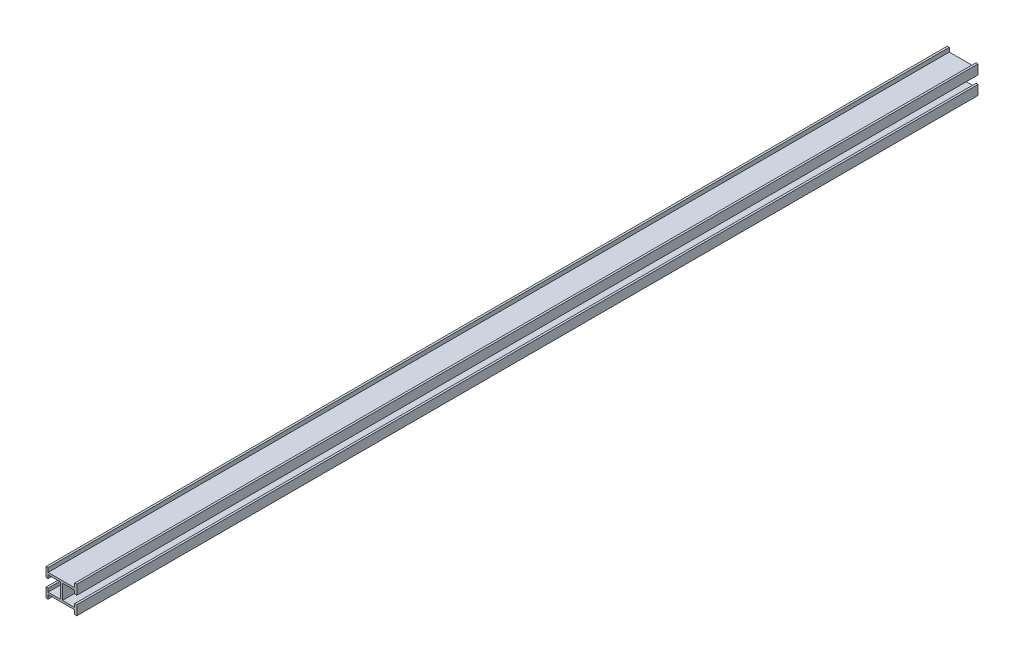
ISO-10303-21;
HEADER;
FILE_DESCRIPTION(('STEP AP214'),'2;1');
FILE_NAME('part.step','',(''),(''),'','','');
FILE_SCHEMA(('AUTOMOTIVE_DESIGN { 1 0 10303 214 1 1 1 1 }'));
ENDSEC;
DATA;
#1=APPLICATION_CONTEXT('core data for automotive mechanical design processes');
#2=APPLICATION_PROTOCOL_DEFINITION('international standard','automotive_design',2000,#1);
#3=PRODUCT_CONTEXT('',#1,'mechanical');
#4=PRODUCT('Part','Part','',(#3));
#5=PRODUCT_RELATED_PRODUCT_CATEGORY('part','',(#4));
#6=PRODUCT_DEFINITION_FORMATION('','',#4);
#7=PRODUCT_DEFINITION_CONTEXT('part definition',#1,'design');
#8=PRODUCT_DEFINITION('design','',#6,#7);
#9=PRODUCT_DEFINITION_SHAPE('','',#8);
#10=(LENGTH_UNIT() NAMED_UNIT(*) SI_UNIT(.MILLI.,.METRE.));
#11=(NAMED_UNIT(*) PLANE_ANGLE_UNIT() SI_UNIT($,.RADIAN.));
#12=(NAMED_UNIT(*) SI_UNIT($,.STERADIAN.) SOLID_ANGLE_UNIT());
#13=UNCERTAINTY_MEASURE_WITH_UNIT(LENGTH_MEASURE(1.E-05),#10,'distance_accuracy_value','');
#14=(GEOMETRIC_REPRESENTATION_CONTEXT(3) GLOBAL_UNCERTAINTY_ASSIGNED_CONTEXT((#13)) GLOBAL_UNIT_ASSIGNED_CONTEXT((#10,
#11,#12)) REPRESENTATION_CONTEXT('',''));
#15=CARTESIAN_POINT('',(0.,0.,0.));
#16=DIRECTION('',(0.,0.,1.));
#17=DIRECTION('',(1.,0.,0.));
#18=AXIS2_PLACEMENT_3D('',#15,#16,#17);
#19=CARTESIAN_POINT('',(-19.5,14.,659.));
#20=DIRECTION('',(-1.,0.,0.));
#21=DIRECTION('',(0.,0.,1.));
#22=AXIS2_PLACEMENT_3D('',#19,#20,#21);
#23=PLANE('',#22);
#24=DIRECTION('',(0.,1.,0.));
#25=VECTOR('',#24,1.);
#26=CARTESIAN_POINT('',(-19.5,14.,-659.));
#27=LINE('',#26,#25);
#28=CARTESIAN_POINT('',(-19.5,14.,-659.));
#29=VERTEX_POINT('',#28);
#30=CARTESIAN_POINT('',(-19.5,20.,-659.));
#31=VERTEX_POINT('',#30);
#32=EDGE_CURVE('E250',#29,#31,#27,.T.);
#33=ORIENTED_EDGE('',*,*,#32,.T.);
#34=DIRECTION('',(0.,0.,-1.));
#35=VECTOR('',#34,1.);
#36=CARTESIAN_POINT('',(-19.5,20.,659.));
#37=LINE('',#36,#35);
#38=CARTESIAN_POINT('',(-19.5,20.,659.));
#39=VERTEX_POINT('',#38);
#40=EDGE_CURVE('E11',#39,#31,#37,.T.);
#41=ORIENTED_EDGE('',*,*,#40,.F.);
#42=DIRECTION('',(0.,1.,0.));
#43=VECTOR('',#42,1.);
#44=CARTESIAN_POINT('',(-19.5,14.,659.));
#45=LINE('',#44,#43);
#46=CARTESIAN_POINT('',(-19.5,14.,659.));
#47=VERTEX_POINT('',#46);
#48=EDGE_CURVE('E319',#47,#39,#45,.T.);
#49=ORIENTED_EDGE('',*,*,#48,.F.);
#50=DIRECTION('',(0.,0.,-1.));
#51=VECTOR('',#50,1.);
#52=CARTESIAN_POINT('',(-19.5,14.,659.));
#53=LINE('',#52,#51);
#54=EDGE_CURVE('E49',#47,#29,#53,.T.);
#55=ORIENTED_EDGE('',*,*,#54,.T.);
#56=EDGE_LOOP('',(#33,#41,#49,#55));
#57=FACE_BOUND('',#56,.T.);
#58=ADVANCED_FACE('F33',(#57),#23,.F.);
#59=CARTESIAN_POINT('',(-19.5,20.,659.));
#60=DIRECTION('',(0.,-1.,0.));
#61=DIRECTION('',(0.,0.,-1.));
#62=AXIS2_PLACEMENT_3D('',#59,#60,#61);
#63=PLANE('',#62);
#64=DIRECTION('',(-1.,0.,0.));
#65=VECTOR('',#64,1.);
#66=CARTESIAN_POINT('',(-19.5,20.,-659.));
#67=LINE('',#66,#65);
#68=CARTESIAN_POINT('',(-22.5,20.,-659.));
#69=VERTEX_POINT('',#68);
#70=EDGE_CURVE('E252',#31,#69,#67,.T.);
#71=ORIENTED_EDGE('',*,*,#70,.T.);
#72=DIRECTION('',(0.,0.,-1.));
#73=VECTOR('',#72,1.);
#74=CARTESIAN_POINT('',(-22.5,20.,659.));
#75=LINE('',#74,#73);
#76=CARTESIAN_POINT('',(-22.5,20.,659.));
#77=VERTEX_POINT('',#76);
#78=EDGE_CURVE('E41',#77,#69,#75,.T.);
#79=ORIENTED_EDGE('',*,*,#78,.F.);
#80=DIRECTION('',(-1.,0.,0.));
#81=VECTOR('',#80,1.);
#82=CARTESIAN_POINT('',(-19.5,20.,659.));
#83=LINE('',#82,#81);
#84=EDGE_CURVE('E147',#39,#77,#83,.T.);
#85=ORIENTED_EDGE('',*,*,#84,.F.);
#86=ORIENTED_EDGE('',*,*,#40,.T.);
#87=EDGE_LOOP('',(#71,#79,#85,#86));
#88=FACE_BOUND('',#87,.T.);
#89=ADVANCED_FACE('F465',(#88),#63,.F.);
#90=CARTESIAN_POINT('',(-22.5,20.,659.));
#91=DIRECTION('',(1.,0.,0.));
#92=DIRECTION('',(0.,0.,-1.));
#93=AXIS2_PLACEMENT_3D('',#90,#91,#92);
#94=PLANE('',#93);
#95=DIRECTION('',(0.,-1.,0.));
#96=VECTOR('',#95,1.);
#97=CARTESIAN_POINT('',(-22.5,20.,-659.));
#98=LINE('',#97,#96);
#99=CARTESIAN_POINT('',(-22.5,6.,-659.));
#100=VERTEX_POINT('',#99);
#101=EDGE_CURVE('E254',#69,#100,#98,.T.);
#102=ORIENTED_EDGE('',*,*,#101,.T.);
#103=DIRECTION('',(0.,0.,-1.));
#104=VECTOR('',#103,1.);
#105=CARTESIAN_POINT('',(-22.5,6.,659.));
#106=LINE('',#105,#104);
#107=CARTESIAN_POINT('',(-22.5,6.,659.));
#108=VERTEX_POINT('',#107);
#109=EDGE_CURVE('E374',#108,#100,#106,.T.);
#110=ORIENTED_EDGE('',*,*,#109,.F.);
#111=DIRECTION('',(0.,-1.,0.));
#112=VECTOR('',#111,1.);
#113=CARTESIAN_POINT('',(-22.5,20.,659.));
#114=LINE('',#113,#112);
#115=EDGE_CURVE('E382',#77,#108,#114,.T.);
#116=ORIENTED_EDGE('',*,*,#115,.F.);
#117=ORIENTED_EDGE('',*,*,#78,.T.);
#118=EDGE_LOOP('',(#102,#110,#116,#117));
#119=FACE_BOUND('',#118,.T.);
#120=ADVANCED_FACE('F380',(#119),#94,.F.);
#121=CARTESIAN_POINT('',(-22.5,6.,659.));
#122=DIRECTION('',(0.,1.,0.));
#123=DIRECTION('',(0.,0.,1.));
#124=AXIS2_PLACEMENT_3D('',#121,#122,#123);
#125=PLANE('',#124);
#126=DIRECTION('',(1.,0.,0.));
#127=VECTOR('',#126,1.);
#128=CARTESIAN_POINT('',(-22.5,6.,-659.));
#129=LINE('',#128,#127);
#130=CARTESIAN_POINT('',(-19.5,6.,-659.));
#131=VERTEX_POINT('',#130);
#132=EDGE_CURVE('E256',#100,#131,#129,.T.);
#133=ORIENTED_EDGE('',*,*,#132,.T.);
#134=DIRECTION('',(0.,0.,-1.));
#135=VECTOR('',#134,1.);
#136=CARTESIAN_POINT('',(-19.5,6.,659.));
#137=LINE('',#136,#135);
#138=CARTESIAN_POINT('',(-19.5,6.,659.));
#139=VERTEX_POINT('',#138);
#140=EDGE_CURVE('E371',#139,#131,#137,.T.);
#141=ORIENTED_EDGE('',*,*,#140,.F.);
#142=DIRECTION('',(1.,0.,0.));
#143=VECTOR('',#142,1.);
#144=CARTESIAN_POINT('',(-22.5,6.,659.));
#145=LINE('',#144,#143);
#146=EDGE_CURVE('E399',#108,#139,#145,.T.);
#147=ORIENTED_EDGE('',*,*,#146,.F.);
#148=ORIENTED_EDGE('',*,*,#109,.T.);
#149=EDGE_LOOP('',(#133,#141,#147,#148));
#150=FACE_BOUND('',#149,.T.);
#151=ADVANCED_FACE('F390',(#150),#125,.F.);
#152=CARTESIAN_POINT('',(-19.5,6.,659.));
#153=DIRECTION('',(-1.,0.,0.));
#154=DIRECTION('',(0.,0.,1.));
#155=AXIS2_PLACEMENT_3D('',#152,#153,#154);
#156=PLANE('',#155);
#157=DIRECTION('',(0.,1.,0.));
#158=VECTOR('',#157,1.);
#159=CARTESIAN_POINT('',(-19.5,6.,-659.));
#160=LINE('',#159,#158);
#161=CARTESIAN_POINT('',(-19.5,11.,-659.));
#162=VERTEX_POINT('',#161);
#163=EDGE_CURVE('E258',#131,#162,#160,.T.);
#164=ORIENTED_EDGE('',*,*,#163,.T.);
#165=DIRECTION('',(0.,0.,-1.));
#166=VECTOR('',#165,1.);
#167=CARTESIAN_POINT('',(-19.5,11.,659.));
#168=LINE('',#167,#166);
#169=CARTESIAN_POINT('',(-19.5,11.,659.));
#170=VERTEX_POINT('',#169);
#171=EDGE_CURVE('E368',#170,#162,#168,.T.);
#172=ORIENTED_EDGE('',*,*,#171,.F.);
#173=DIRECTION('',(0.,1.,0.));
#174=VECTOR('',#173,1.);
#175=CARTESIAN_POINT('',(-19.5,6.,659.));
#176=LINE('',#175,#174);
#177=EDGE_CURVE('E396',#139,#170,#176,.T.);
#178=ORIENTED_EDGE('',*,*,#177,.F.);
#179=ORIENTED_EDGE('',*,*,#140,.T.);
#180=EDGE_LOOP('',(#164,#172,#178,#179));
#181=FACE_BOUND('',#180,.T.);
#182=ADVANCED_FACE('F394',(#181),#156,.F.);
#183=CARTESIAN_POINT('',(-19.5,11.,659.));
#184=DIRECTION('',(0.,1.,0.));
#185=DIRECTION('',(-1.,0.,0.));
#186=AXIS2_PLACEMENT_3D('',#183,#184,#185);
#187=PLANE('',#186);
#188=DIRECTION('',(1.,0.,0.));
#189=VECTOR('',#188,1.);
#190=CARTESIAN_POINT('',(-19.5,11.,-659.));
#191=LINE('',#190,#189);
#192=CARTESIAN_POINT('',(-1.5,11.,-659.));
#193=VERTEX_POINT('',#192);
#194=EDGE_CURVE('E260',#162,#193,#191,.T.);
#195=ORIENTED_EDGE('',*,*,#194,.T.);
#196=DIRECTION('',(0.,0.,-1.));
#197=VECTOR('',#196,1.);
#198=CARTESIAN_POINT('',(-1.5,11.,659.));
#199=LINE('',#198,#197);
#200=CARTESIAN_POINT('',(-1.5,11.,659.));
#201=VERTEX_POINT('',#200);
#202=EDGE_CURVE('E365',#201,#193,#199,.T.);
#203=ORIENTED_EDGE('',*,*,#202,.F.);
#204=DIRECTION('',(1.,0.,0.));
#205=VECTOR('',#204,1.);
#206=CARTESIAN_POINT('',(-19.5,11.,659.));
#207=LINE('',#206,#205);
#208=EDGE_CURVE('E398',#170,#201,#207,.T.);
#209=ORIENTED_EDGE('',*,*,#208,.F.);
#210=ORIENTED_EDGE('',*,*,#171,.T.);
#211=EDGE_LOOP('',(#195,#203,#209,#210));
#212=FACE_BOUND('',#211,.T.);
#213=ADVANCED_FACE('F481',(#212),#187,.F.);
#214=CARTESIAN_POINT('',(-1.5,11.,659.));
#215=DIRECTION('',(1.,0.,0.));
#216=DIRECTION('',(0.,0.,-1.));
#217=AXIS2_PLACEMENT_3D('',#214,#215,#216);
#218=PLANE('',#217);
#219=DIRECTION('',(0.,-1.,0.));
#220=VECTOR('',#219,1.);
#221=CARTESIAN_POINT('',(-1.5,11.,-659.));
#222=LINE('',#221,#220);
#223=CARTESIAN_POINT('',(-1.5,-11.,-659.));
#224=VERTEX_POINT('',#223);
#225=EDGE_CURVE('E262',#193,#224,#222,.T.);
#226=ORIENTED_EDGE('',*,*,#225,.T.);
#227=DIRECTION('',(0.,0.,-1.));
#228=VECTOR('',#227,1.);
#229=CARTESIAN_POINT('',(-1.5,-11.,659.));
#230=LINE('',#229,#228);
#231=CARTESIAN_POINT('',(-1.5,-11.,659.));
#232=VERTEX_POINT('',#231);
#233=EDGE_CURVE('E363',#232,#224,#230,.T.);
#234=ORIENTED_EDGE('',*,*,#233,.F.);
#235=DIRECTION('',(0.,-1.,0.));
#236=VECTOR('',#235,1.);
#237=CARTESIAN_POINT('',(-1.5,11.,659.));
#238=LINE('',#237,#236);
#239=EDGE_CURVE('E401',#201,#232,#238,.T.);
#240=ORIENTED_EDGE('',*,*,#239,.F.);
#241=ORIENTED_EDGE('',*,*,#202,.T.);
#242=EDGE_LOOP('',(#226,#234,#240,#241));
#243=FACE_BOUND('',#242,.T.);
#244=ADVANCED_FACE('F484',(#243),#218,.F.);
#245=CARTESIAN_POINT('',(-19.5,-11.,659.));
#246=DIRECTION('',(0.,1.,0.));
#247=DIRECTION('',(-1.,0.,0.));
#248=AXIS2_PLACEMENT_3D('',#245,#246,#247);
#249=PLANE('',#248);
#250=DIRECTION('',(1.,0.,0.));
#251=VECTOR('',#250,1.);
#252=CARTESIAN_POINT('',(-19.5,-11.,-659.));
#253=LINE('',#252,#251);
#254=CARTESIAN_POINT('',(-19.5,-11.,-659.));
#255=VERTEX_POINT('',#254);
#256=EDGE_CURVE('E265',#255,#224,#253,.T.);
#257=ORIENTED_EDGE('',*,*,#256,.F.);
#258=DIRECTION('',(0.,0.,-1.));
#259=VECTOR('',#258,1.);
#260=CARTESIAN_POINT('',(-19.5,-11.,659.));
#261=LINE('',#260,#259);
#262=CARTESIAN_POINT('',(-19.5,-11.,659.));
#263=VERTEX_POINT('',#262);
#264=EDGE_CURVE('E361',#263,#255,#261,.T.);
#265=ORIENTED_EDGE('',*,*,#264,.F.);
#266=DIRECTION('',(1.,0.,0.));
#267=VECTOR('',#266,1.);
#268=CARTESIAN_POINT('',(-19.5,-11.,659.));
#269=LINE('',#268,#267);
#270=EDGE_CURVE('E407',#263,#232,#269,.T.);
#271=ORIENTED_EDGE('',*,*,#270,.T.);
#272=ORIENTED_EDGE('',*,*,#233,.T.);
#273=EDGE_LOOP('',(#257,#265,#271,#272));
#274=FACE_BOUND('',#273,.T.);
#275=ADVANCED_FACE('F488',(#274),#249,.T.);
#276=CARTESIAN_POINT('',(-19.5,-6.,659.));
#277=DIRECTION('',(1.,0.,0.));
#278=DIRECTION('',(0.,0.,-1.));
#279=AXIS2_PLACEMENT_3D('',#276,#277,#278);
#280=PLANE('',#279);
#281=DIRECTION('',(0.,-1.,0.));
#282=VECTOR('',#281,1.);
#283=CARTESIAN_POINT('',(-19.5,-6.,-659.));
#284=LINE('',#283,#282);
#285=CARTESIAN_POINT('',(-19.5,-6.,-659.));
#286=VERTEX_POINT('',#285);
#287=EDGE_CURVE('E268',#286,#255,#284,.T.);
#288=ORIENTED_EDGE('',*,*,#287,.F.);
#289=DIRECTION('',(0.,0.,-1.));
#290=VECTOR('',#289,1.);
#291=CARTESIAN_POINT('',(-19.5,-6.,659.));
#292=LINE('',#291,#290);
#293=CARTESIAN_POINT('',(-19.5,-6.,659.));
#294=VERTEX_POINT('',#293);
#295=EDGE_CURVE('E359',#294,#286,#292,.T.);
#296=ORIENTED_EDGE('',*,*,#295,.F.);
#297=DIRECTION('',(0.,-1.,0.));
#298=VECTOR('',#297,1.);
#299=CARTESIAN_POINT('',(-19.5,-6.,659.));
#300=LINE('',#299,#298);
#301=EDGE_CURVE('E410',#294,#263,#300,.T.);
#302=ORIENTED_EDGE('',*,*,#301,.T.);
#303=ORIENTED_EDGE('',*,*,#264,.T.);
#304=EDGE_LOOP('',(#288,#296,#302,#303));
#305=FACE_BOUND('',#304,.T.);
#306=ADVANCED_FACE('F492',(#305),#280,.T.);
#307=CARTESIAN_POINT('',(-22.5,-6.,659.));
#308=DIRECTION('',(0.,1.,0.));
#309=DIRECTION('',(0.,0.,1.));
#310=AXIS2_PLACEMENT_3D('',#307,#308,#309);
#311=PLANE('',#310);
#312=DIRECTION('',(1.,0.,0.));
#313=VECTOR('',#312,1.);
#314=CARTESIAN_POINT('',(-22.5,-6.,-659.));
#315=LINE('',#314,#313);
#316=CARTESIAN_POINT('',(-22.5,-6.,-659.));
#317=VERTEX_POINT('',#316);
#318=EDGE_CURVE('E271',#317,#286,#315,.T.);
#319=ORIENTED_EDGE('',*,*,#318,.F.);
#320=DIRECTION('',(0.,0.,-1.));
#321=VECTOR('',#320,1.);
#322=CARTESIAN_POINT('',(-22.5,-6.,659.));
#323=LINE('',#322,#321);
#324=CARTESIAN_POINT('',(-22.5,-6.,659.));
#325=VERTEX_POINT('',#324);
#326=EDGE_CURVE('E357',#325,#317,#323,.T.);
#327=ORIENTED_EDGE('',*,*,#326,.F.);
#328=DIRECTION('',(1.,0.,0.));
#329=VECTOR('',#328,1.);
#330=CARTESIAN_POINT('',(-22.5,-6.,659.));
#331=LINE('',#330,#329);
#332=EDGE_CURVE('E413',#325,#294,#331,.T.);
#333=ORIENTED_EDGE('',*,*,#332,.T.);
#334=ORIENTED_EDGE('',*,*,#295,.T.);
#335=EDGE_LOOP('',(#319,#327,#333,#334));
#336=FACE_BOUND('',#335,.T.);
#337=ADVANCED_FACE('F496',(#336),#311,.T.);
#338=CARTESIAN_POINT('',(-22.5,-20.,659.));
#339=DIRECTION('',(-1.,0.,0.));
#340=DIRECTION('',(0.,0.,1.));
#341=AXIS2_PLACEMENT_3D('',#338,#339,#340);
#342=PLANE('',#341);
#343=DIRECTION('',(0.,1.,0.));
#344=VECTOR('',#343,1.);
#345=CARTESIAN_POINT('',(-22.5,-20.,-659.));
#346=LINE('',#345,#344);
#347=CARTESIAN_POINT('',(-22.5,-20.,-659.));
#348=VERTEX_POINT('',#347);
#349=EDGE_CURVE('E274',#348,#317,#346,.T.);
#350=ORIENTED_EDGE('',*,*,#349,.F.);
#351=DIRECTION('',(0.,0.,-1.));
#352=VECTOR('',#351,1.);
#353=CARTESIAN_POINT('',(-22.5,-20.,659.));
#354=LINE('',#353,#352);
#355=CARTESIAN_POINT('',(-22.5,-20.,659.));
#356=VERTEX_POINT('',#355);
#357=EDGE_CURVE('E355',#356,#348,#354,.T.);
#358=ORIENTED_EDGE('',*,*,#357,.F.);
#359=DIRECTION('',(0.,1.,0.));
#360=VECTOR('',#359,1.);
#361=CARTESIAN_POINT('',(-22.5,-20.,659.));
#362=LINE('',#361,#360);
#363=EDGE_CURVE('E416',#356,#325,#362,.T.);
#364=ORIENTED_EDGE('',*,*,#363,.T.);
#365=ORIENTED_EDGE('',*,*,#326,.T.);
#366=EDGE_LOOP('',(#350,#358,#364,#365));
#367=FACE_BOUND('',#366,.T.);
#368=ADVANCED_FACE('F500',(#367),#342,.T.);
#369=CARTESIAN_POINT('',(-19.5,-20.,659.));
#370=DIRECTION('',(0.,-1.,0.));
#371=DIRECTION('',(0.,0.,-1.));
#372=AXIS2_PLACEMENT_3D('',#369,#370,#371);
#373=PLANE('',#372);
#374=DIRECTION('',(-1.,0.,0.));
#375=VECTOR('',#374,1.);
#376=CARTESIAN_POINT('',(-19.5,-20.,-659.));
#377=LINE('',#376,#375);
#378=CARTESIAN_POINT('',(-19.5,-20.,-659.));
#379=VERTEX_POINT('',#378);
#380=EDGE_CURVE('E277',#379,#348,#377,.T.);
#381=ORIENTED_EDGE('',*,*,#380,.F.);
#382=DIRECTION('',(0.,0.,-1.));
#383=VECTOR('',#382,1.);
#384=CARTESIAN_POINT('',(-19.5,-20.,659.));
#385=LINE('',#384,#383);
#386=CARTESIAN_POINT('',(-19.5,-20.,659.));
#387=VERTEX_POINT('',#386);
#388=EDGE_CURVE('E353',#387,#379,#385,.T.);
#389=ORIENTED_EDGE('',*,*,#388,.F.);
#390=DIRECTION('',(-1.,0.,0.));
#391=VECTOR('',#390,1.);
#392=CARTESIAN_POINT('',(-19.5,-20.,659.));
#393=LINE('',#392,#391);
#394=EDGE_CURVE('E419',#387,#356,#393,.T.);
#395=ORIENTED_EDGE('',*,*,#394,.T.);
#396=ORIENTED_EDGE('',*,*,#357,.T.);
#397=EDGE_LOOP('',(#381,#389,#395,#396));
#398=FACE_BOUND('',#397,.T.);
#399=ADVANCED_FACE('F504',(#398),#373,.T.);
#400=CARTESIAN_POINT('',(-19.5,-14.,659.));
#401=DIRECTION('',(1.,0.,0.));
#402=DIRECTION('',(0.,0.,-1.));
#403=AXIS2_PLACEMENT_3D('',#400,#401,#402);
#404=PLANE('',#403);
#405=DIRECTION('',(0.,-1.,0.));
#406=VECTOR('',#405,1.);
#407=CARTESIAN_POINT('',(-19.5,-14.,-659.));
#408=LINE('',#407,#406);
#409=CARTESIAN_POINT('',(-19.5,-14.,-659.));
#410=VERTEX_POINT('',#409);
#411=EDGE_CURVE('E280',#410,#379,#408,.T.);
#412=ORIENTED_EDGE('',*,*,#411,.F.);
#413=DIRECTION('',(0.,0.,-1.));
#414=VECTOR('',#413,1.);
#415=CARTESIAN_POINT('',(-19.5,-14.,659.));
#416=LINE('',#415,#414);
#417=CARTESIAN_POINT('',(-19.5,-14.,659.));
#418=VERTEX_POINT('',#417);
#419=EDGE_CURVE('E351',#418,#410,#416,.T.);
#420=ORIENTED_EDGE('',*,*,#419,.F.);
#421=DIRECTION('',(0.,-1.,0.));
#422=VECTOR('',#421,1.);
#423=CARTESIAN_POINT('',(-19.5,-14.,659.));
#424=LINE('',#423,#422);
#425=EDGE_CURVE('E422',#418,#387,#424,.T.);
#426=ORIENTED_EDGE('',*,*,#425,.T.);
#427=ORIENTED_EDGE('',*,*,#388,.T.);
#428=EDGE_LOOP('',(#412,#420,#426,#427));
#429=FACE_BOUND('',#428,.T.);
#430=ADVANCED_FACE('F508',(#429),#404,.T.);
#431=CARTESIAN_POINT('',(-19.5,-14.,659.));
#432=DIRECTION('',(0.,1.,0.));
#433=DIRECTION('',(-1.,0.,0.));
#434=AXIS2_PLACEMENT_3D('',#431,#432,#433);
#435=PLANE('',#434);
#436=DIRECTION('',(1.,0.,0.));
#437=VECTOR('',#436,1.);
#438=CARTESIAN_POINT('',(-19.5,-14.,-659.));
#439=LINE('',#438,#437);
#440=CARTESIAN_POINT('',(19.5,-14.,-659.));
#441=VERTEX_POINT('',#440);
#442=EDGE_CURVE('E283',#410,#441,#439,.T.);
#443=ORIENTED_EDGE('',*,*,#442,.T.);
#444=DIRECTION('',(0.,0.,-1.));
#445=VECTOR('',#444,1.);
#446=CARTESIAN_POINT('',(19.5,-14.,659.));
#447=LINE('',#446,#445);
#448=CARTESIAN_POINT('',(19.5,-14.,659.));
#449=VERTEX_POINT('',#448);
#450=EDGE_CURVE('E348',#449,#441,#447,.T.);
#451=ORIENTED_EDGE('',*,*,#450,.F.);
#452=DIRECTION('',(1.,0.,0.));
#453=VECTOR('',#452,1.);
#454=CARTESIAN_POINT('',(-19.5,-14.,659.));
#455=LINE('',#454,#453);
#456=EDGE_CURVE('E425',#418,#449,#455,.T.);
#457=ORIENTED_EDGE('',*,*,#456,.F.);
#458=ORIENTED_EDGE('',*,*,#419,.T.);
#459=EDGE_LOOP('',(#443,#451,#457,#458));
#460=FACE_BOUND('',#459,.T.);
#461=ADVANCED_FACE('F512',(#460),#435,.F.);
#462=CARTESIAN_POINT('',(19.5,-14.,659.));
#463=DIRECTION('',(1.,0.,0.));
#464=DIRECTION('',(0.,0.,-1.));
#465=AXIS2_PLACEMENT_3D('',#462,#463,#464);
#466=PLANE('',#465);
#467=DIRECTION('',(0.,-1.,0.));
#468=VECTOR('',#467,1.);
#469=CARTESIAN_POINT('',(19.5,-14.,-659.));
#470=LINE('',#469,#468);
#471=CARTESIAN_POINT('',(19.5,-20.,-659.));
#472=VERTEX_POINT('',#471);
#473=EDGE_CURVE('E285',#441,#472,#470,.T.);
#474=ORIENTED_EDGE('',*,*,#473,.T.);
#475=DIRECTION('',(0.,0.,-1.));
#476=VECTOR('',#475,1.);
#477=CARTESIAN_POINT('',(19.5,-20.,659.));
#478=LINE('',#477,#476);
#479=CARTESIAN_POINT('',(19.5,-20.,659.));
#480=VERTEX_POINT('',#479);
#481=EDGE_CURVE('E345',#480,#472,#478,.T.);
#482=ORIENTED_EDGE('',*,*,#481,.F.);
#483=DIRECTION('',(0.,-1.,0.));
#484=VECTOR('',#483,1.);
#485=CARTESIAN_POINT('',(19.5,-14.,659.));
#486=LINE('',#485,#484);
#487=EDGE_CURVE('E427',#449,#480,#486,.T.);
#488=ORIENTED_EDGE('',*,*,#487,.F.);
#489=ORIENTED_EDGE('',*,*,#450,.T.);
#490=EDGE_LOOP('',(#474,#482,#488,#489));
#491=FACE_BOUND('',#490,.T.);
#492=ADVANCED_FACE('F516',(#491),#466,.F.);
#493=CARTESIAN_POINT('',(19.5,-20.,659.));
#494=DIRECTION('',(0.,1.,0.));
#495=DIRECTION('',(0.,0.,1.));
#496=AXIS2_PLACEMENT_3D('',#493,#494,#495);
#497=PLANE('',#496);
#498=DIRECTION('',(1.,0.,0.));
#499=VECTOR('',#498,1.);
#500=CARTESIAN_POINT('',(19.5,-20.,-659.));
#501=LINE('',#500,#499);
#502=CARTESIAN_POINT('',(22.5,-20.,-659.));
#503=VERTEX_POINT('',#502);
#504=EDGE_CURVE('E287',#472,#503,#501,.T.);
#505=ORIENTED_EDGE('',*,*,#504,.T.);
#506=DIRECTION('',(0.,0.,-1.));
#507=VECTOR('',#506,1.);
#508=CARTESIAN_POINT('',(22.5,-20.,659.));
#509=LINE('',#508,#507);
#510=CARTESIAN_POINT('',(22.5,-20.,659.));
#511=VERTEX_POINT('',#510);
#512=EDGE_CURVE('E342',#511,#503,#509,.T.);
#513=ORIENTED_EDGE('',*,*,#512,.F.);
#514=DIRECTION('',(1.,0.,0.));
#515=VECTOR('',#514,1.);
#516=CARTESIAN_POINT('',(19.5,-20.,659.));
#517=LINE('',#516,#515);
#518=EDGE_CURVE('E429',#480,#511,#517,.T.);
#519=ORIENTED_EDGE('',*,*,#518,.F.);
#520=ORIENTED_EDGE('',*,*,#481,.T.);
#521=EDGE_LOOP('',(#505,#513,#519,#520));
#522=FACE_BOUND('',#521,.T.);
#523=ADVANCED_FACE('F520',(#522),#497,.F.);
#524=CARTESIAN_POINT('',(22.5,-20.,659.));
#525=DIRECTION('',(-1.,0.,0.));
#526=DIRECTION('',(0.,0.,1.));
#527=AXIS2_PLACEMENT_3D('',#524,#525,#526);
#528=PLANE('',#527);
#529=DIRECTION('',(0.,1.,0.));
#530=VECTOR('',#529,1.);
#531=CARTESIAN_POINT('',(22.5,-20.,-659.));
#532=LINE('',#531,#530);
#533=CARTESIAN_POINT('',(22.5,-6.,-659.));
#534=VERTEX_POINT('',#533);
#535=EDGE_CURVE('E289',#503,#534,#532,.T.);
#536=ORIENTED_EDGE('',*,*,#535,.T.);
#537=DIRECTION('',(0.,0.,-1.));
#538=VECTOR('',#537,1.);
#539=CARTESIAN_POINT('',(22.5,-6.,659.));
#540=LINE('',#539,#538);
#541=CARTESIAN_POINT('',(22.5,-6.,659.));
#542=VERTEX_POINT('',#541);
#543=EDGE_CURVE('E339',#542,#534,#540,.T.);
#544=ORIENTED_EDGE('',*,*,#543,.F.);
#545=DIRECTION('',(0.,1.,0.));
#546=VECTOR('',#545,1.);
#547=CARTESIAN_POINT('',(22.5,-20.,659.));
#548=LINE('',#547,#546);
#549=EDGE_CURVE('E431',#511,#542,#548,.T.);
#550=ORIENTED_EDGE('',*,*,#549,.F.);
#551=ORIENTED_EDGE('',*,*,#512,.T.);
#552=EDGE_LOOP('',(#536,#544,#550,#551));
#553=FACE_BOUND('',#552,.T.);
#554=ADVANCED_FACE('F524',(#553),#528,.F.);
#555=CARTESIAN_POINT('',(22.5,-6.,659.));
#556=DIRECTION('',(0.,-1.,0.));
#557=DIRECTION('',(0.,0.,-1.));
#558=AXIS2_PLACEMENT_3D('',#555,#556,#557);
#559=PLANE('',#558);
#560=DIRECTION('',(-1.,0.,0.));
#561=VECTOR('',#560,1.);
#562=CARTESIAN_POINT('',(22.5,-6.,-659.));
#563=LINE('',#562,#561);
#564=CARTESIAN_POINT('',(19.5,-6.,-659.));
#565=VERTEX_POINT('',#564);
#566=EDGE_CURVE('E291',#534,#565,#563,.T.);
#567=ORIENTED_EDGE('',*,*,#566,.T.);
#568=DIRECTION('',(0.,0.,-1.));
#569=VECTOR('',#568,1.);
#570=CARTESIAN_POINT('',(19.5,-6.,659.));
#571=LINE('',#570,#569);
#572=CARTESIAN_POINT('',(19.5,-6.,659.));
#573=VERTEX_POINT('',#572);
#574=EDGE_CURVE('E336',#573,#565,#571,.T.);
#575=ORIENTED_EDGE('',*,*,#574,.F.);
#576=DIRECTION('',(-1.,0.,0.));
#577=VECTOR('',#576,1.);
#578=CARTESIAN_POINT('',(22.5,-6.,659.));
#579=LINE('',#578,#577);
#580=EDGE_CURVE('E433',#542,#573,#579,.T.);
#581=ORIENTED_EDGE('',*,*,#580,.F.);
#582=ORIENTED_EDGE('',*,*,#543,.T.);
#583=EDGE_LOOP('',(#567,#575,#581,#582));
#584=FACE_BOUND('',#583,.T.);
#585=ADVANCED_FACE('F528',(#584),#559,.F.);
#586=CARTESIAN_POINT('',(19.5,-6.,659.));
#587=DIRECTION('',(1.,0.,0.));
#588=DIRECTION('',(0.,0.,-1.));
#589=AXIS2_PLACEMENT_3D('',#586,#587,#588);
#590=PLANE('',#589);
#591=DIRECTION('',(0.,-1.,0.));
#592=VECTOR('',#591,1.);
#593=CARTESIAN_POINT('',(19.5,-6.,-659.));
#594=LINE('',#593,#592);
#595=CARTESIAN_POINT('',(19.5,-11.,-659.));
#596=VERTEX_POINT('',#595);
#597=EDGE_CURVE('E293',#565,#596,#594,.T.);
#598=ORIENTED_EDGE('',*,*,#597,.T.);
#599=DIRECTION('',(0.,0.,-1.));
#600=VECTOR('',#599,1.);
#601=CARTESIAN_POINT('',(19.5,-11.,659.));
#602=LINE('',#601,#600);
#603=CARTESIAN_POINT('',(19.5,-11.,659.));
#604=VERTEX_POINT('',#603);
#605=EDGE_CURVE('E333',#604,#596,#602,.T.);
#606=ORIENTED_EDGE('',*,*,#605,.F.);
#607=DIRECTION('',(0.,-1.,0.));
#608=VECTOR('',#607,1.);
#609=CARTESIAN_POINT('',(19.5,-6.,659.));
#610=LINE('',#609,#608);
#611=EDGE_CURVE('E435',#573,#604,#610,.T.);
#612=ORIENTED_EDGE('',*,*,#611,.F.);
#613=ORIENTED_EDGE('',*,*,#574,.T.);
#614=EDGE_LOOP('',(#598,#606,#612,#613));
#615=FACE_BOUND('',#614,.T.);
#616=ADVANCED_FACE('F532',(#615),#590,.F.);
#617=CARTESIAN_POINT('',(19.5,-11.,659.));
#618=DIRECTION('',(0.,-1.,0.));
#619=DIRECTION('',(1.,0.,0.));
#620=AXIS2_PLACEMENT_3D('',#617,#618,#619);
#621=PLANE('',#620);
#622=DIRECTION('',(-1.,0.,0.));
#623=VECTOR('',#622,1.);
#624=CARTESIAN_POINT('',(19.5,-11.,-659.));
#625=LINE('',#624,#623);
#626=CARTESIAN_POINT('',(1.5,-11.,-659.));
#627=VERTEX_POINT('',#626);
#628=EDGE_CURVE('E295',#596,#627,#625,.T.);
#629=ORIENTED_EDGE('',*,*,#628,.T.);
#630=DIRECTION('',(0.,0.,-1.));
#631=VECTOR('',#630,1.);
#632=CARTESIAN_POINT('',(1.5,-11.,659.));
#633=LINE('',#632,#631);
#634=CARTESIAN_POINT('',(1.5,-11.,659.));
#635=VERTEX_POINT('',#634);
#636=EDGE_CURVE('E331',#635,#627,#633,.T.);
#637=ORIENTED_EDGE('',*,*,#636,.F.);
#638=DIRECTION('',(-1.,0.,0.));
#639=VECTOR('',#638,1.);
#640=CARTESIAN_POINT('',(19.5,-11.,659.));
#641=LINE('',#640,#639);
#642=EDGE_CURVE('E437',#604,#635,#641,.T.);
#643=ORIENTED_EDGE('',*,*,#642,.F.);
#644=ORIENTED_EDGE('',*,*,#605,.T.);
#645=EDGE_LOOP('',(#629,#637,#643,#644));
#646=FACE_BOUND('',#645,.T.);
#647=ADVANCED_FACE('F536',(#646),#621,.F.);
#648=CARTESIAN_POINT('',(1.5,11.,659.));
#649=DIRECTION('',(1.,0.,0.));
#650=DIRECTION('',(0.,0.,-1.));
#651=AXIS2_PLACEMENT_3D('',#648,#649,#650);
#652=PLANE('',#651);
#653=DIRECTION('',(0.,-1.,0.));
#654=VECTOR('',#653,1.);
#655=CARTESIAN_POINT('',(1.5,11.,-659.));
#656=LINE('',#655,#654);
#657=CARTESIAN_POINT('',(1.5,11.,-659.));
#658=VERTEX_POINT('',#657);
#659=EDGE_CURVE('E298',#658,#627,#656,.T.);
#660=ORIENTED_EDGE('',*,*,#659,.F.);
#661=DIRECTION('',(0.,0.,-1.));
#662=VECTOR('',#661,1.);
#663=CARTESIAN_POINT('',(1.5,11.,659.));
#664=LINE('',#663,#662);
#665=CARTESIAN_POINT('',(1.5,11.,659.));
#666=VERTEX_POINT('',#665);
#667=EDGE_CURVE('E329',#666,#658,#664,.T.);
#668=ORIENTED_EDGE('',*,*,#667,.F.);
#669=DIRECTION('',(0.,-1.,0.));
#670=VECTOR('',#669,1.);
#671=CARTESIAN_POINT('',(1.5,11.,659.));
#672=LINE('',#671,#670);
#673=EDGE_CURVE('E439',#666,#635,#672,.T.);
#674=ORIENTED_EDGE('',*,*,#673,.T.);
#675=ORIENTED_EDGE('',*,*,#636,.T.);
#676=EDGE_LOOP('',(#660,#668,#674,#675));
#677=FACE_BOUND('',#676,.T.);
#678=ADVANCED_FACE('F540',(#677),#652,.T.);
#679=CARTESIAN_POINT('',(19.5,11.,659.));
#680=DIRECTION('',(0.,-1.,0.));
#681=DIRECTION('',(1.,0.,0.));
#682=AXIS2_PLACEMENT_3D('',#679,#680,#681);
#683=PLANE('',#682);
#684=DIRECTION('',(-1.,0.,0.));
#685=VECTOR('',#684,1.);
#686=CARTESIAN_POINT('',(19.5,11.,-659.));
#687=LINE('',#686,#685);
#688=CARTESIAN_POINT('',(19.5,11.,-659.));
#689=VERTEX_POINT('',#688);
#690=EDGE_CURVE('E301',#689,#658,#687,.T.);
#691=ORIENTED_EDGE('',*,*,#690,.F.);
#692=DIRECTION('',(0.,0.,-1.));
#693=VECTOR('',#692,1.);
#694=CARTESIAN_POINT('',(19.5,11.,659.));
#695=LINE('',#694,#693);
#696=CARTESIAN_POINT('',(19.5,11.,659.));
#697=VERTEX_POINT('',#696);
#698=EDGE_CURVE('E327',#697,#689,#695,.T.);
#699=ORIENTED_EDGE('',*,*,#698,.F.);
#700=DIRECTION('',(-1.,0.,0.));
#701=VECTOR('',#700,1.);
#702=CARTESIAN_POINT('',(19.5,11.,659.));
#703=LINE('',#702,#701);
#704=EDGE_CURVE('E442',#697,#666,#703,.T.);
#705=ORIENTED_EDGE('',*,*,#704,.T.);
#706=ORIENTED_EDGE('',*,*,#667,.T.);
#707=EDGE_LOOP('',(#691,#699,#705,#706));
#708=FACE_BOUND('',#707,.T.);
#709=ADVANCED_FACE('F544',(#708),#683,.T.);
#710=CARTESIAN_POINT('',(19.5,6.,659.));
#711=DIRECTION('',(-1.,0.,0.));
#712=DIRECTION('',(0.,0.,1.));
#713=AXIS2_PLACEMENT_3D('',#710,#711,#712);
#714=PLANE('',#713);
#715=DIRECTION('',(0.,1.,0.));
#716=VECTOR('',#715,1.);
#717=CARTESIAN_POINT('',(19.5,6.,-659.));
#718=LINE('',#717,#716);
#719=CARTESIAN_POINT('',(19.5,6.,-659.));
#720=VERTEX_POINT('',#719);
#721=EDGE_CURVE('E304',#720,#689,#718,.T.);
#722=ORIENTED_EDGE('',*,*,#721,.F.);
#723=DIRECTION('',(0.,0.,-1.));
#724=VECTOR('',#723,1.);
#725=CARTESIAN_POINT('',(19.5,6.,659.));
#726=LINE('',#725,#724);
#727=CARTESIAN_POINT('',(19.5,6.,659.));
#728=VERTEX_POINT('',#727);
#729=EDGE_CURVE('E325',#728,#720,#726,.T.);
#730=ORIENTED_EDGE('',*,*,#729,.F.);
#731=DIRECTION('',(0.,1.,0.));
#732=VECTOR('',#731,1.);
#733=CARTESIAN_POINT('',(19.5,6.,659.));
#734=LINE('',#733,#732);
#735=EDGE_CURVE('E445',#728,#697,#734,.T.);
#736=ORIENTED_EDGE('',*,*,#735,.T.);
#737=ORIENTED_EDGE('',*,*,#698,.T.);
#738=EDGE_LOOP('',(#722,#730,#736,#737));
#739=FACE_BOUND('',#738,.T.);
#740=ADVANCED_FACE('F548',(#739),#714,.T.);
#741=CARTESIAN_POINT('',(22.5,6.,659.));
#742=DIRECTION('',(0.,-1.,0.));
#743=DIRECTION('',(0.,0.,-1.));
#744=AXIS2_PLACEMENT_3D('',#741,#742,#743);
#745=PLANE('',#744);
#746=DIRECTION('',(-1.,0.,0.));
#747=VECTOR('',#746,1.);
#748=CARTESIAN_POINT('',(22.5,6.,-659.));
#749=LINE('',#748,#747);
#750=CARTESIAN_POINT('',(22.5,6.,-659.));
#751=VERTEX_POINT('',#750);
#752=EDGE_CURVE('E307',#751,#720,#749,.T.);
#753=ORIENTED_EDGE('',*,*,#752,.F.);
#754=DIRECTION('',(0.,0.,-1.));
#755=VECTOR('',#754,1.);
#756=CARTESIAN_POINT('',(22.5,6.,659.));
#757=LINE('',#756,#755);
#758=CARTESIAN_POINT('',(22.5,6.,659.));
#759=VERTEX_POINT('',#758);
#760=EDGE_CURVE('E323',#759,#751,#757,.T.);
#761=ORIENTED_EDGE('',*,*,#760,.F.);
#762=DIRECTION('',(-1.,0.,0.));
#763=VECTOR('',#762,1.);
#764=CARTESIAN_POINT('',(22.5,6.,659.));
#765=LINE('',#764,#763);
#766=EDGE_CURVE('E448',#759,#728,#765,.T.);
#767=ORIENTED_EDGE('',*,*,#766,.T.);
#768=ORIENTED_EDGE('',*,*,#729,.T.);
#769=EDGE_LOOP('',(#753,#761,#767,#768));
#770=FACE_BOUND('',#769,.T.);
#771=ADVANCED_FACE('F552',(#770),#745,.T.);
#772=CARTESIAN_POINT('',(22.5,20.,659.));
#773=DIRECTION('',(1.,0.,0.));
#774=DIRECTION('',(0.,0.,-1.));
#775=AXIS2_PLACEMENT_3D('',#772,#773,#774);
#776=PLANE('',#775);
#777=DIRECTION('',(0.,-1.,0.));
#778=VECTOR('',#777,1.);
#779=CARTESIAN_POINT('',(22.5,20.,-659.));
#780=LINE('',#779,#778);
#781=CARTESIAN_POINT('',(22.5,20.,-659.));
#782=VERTEX_POINT('',#781);
#783=EDGE_CURVE('E310',#782,#751,#780,.T.);
#784=ORIENTED_EDGE('',*,*,#783,.F.);
#785=DIRECTION('',(0.,0.,-1.));
#786=VECTOR('',#785,1.);
#787=CARTESIAN_POINT('',(22.5,20.,659.));
#788=LINE('',#787,#786);
#789=CARTESIAN_POINT('',(22.5,20.,659.));
#790=VERTEX_POINT('',#789);
#791=EDGE_CURVE('E232',#790,#782,#788,.T.);
#792=ORIENTED_EDGE('',*,*,#791,.F.);
#793=DIRECTION('',(0.,-1.,0.));
#794=VECTOR('',#793,1.);
#795=CARTESIAN_POINT('',(22.5,20.,659.));
#796=LINE('',#795,#794);
#797=EDGE_CURVE('E242',#790,#759,#796,.T.);
#798=ORIENTED_EDGE('',*,*,#797,.T.);
#799=ORIENTED_EDGE('',*,*,#760,.T.);
#800=EDGE_LOOP('',(#784,#792,#798,#799));
#801=FACE_BOUND('',#800,.T.);
#802=ADVANCED_FACE('F452',(#801),#776,.T.);
#803=CARTESIAN_POINT('',(19.5,20.,659.));
#804=DIRECTION('',(0.,1.,0.));
#805=DIRECTION('',(0.,0.,1.));
#806=AXIS2_PLACEMENT_3D('',#803,#804,#805);
#807=PLANE('',#806);
#808=DIRECTION('',(1.,0.,0.));
#809=VECTOR('',#808,1.);
#810=CARTESIAN_POINT('',(19.5,20.,-659.));
#811=LINE('',#810,#809);
#812=CARTESIAN_POINT('',(19.5,20.,-659.));
#813=VERTEX_POINT('',#812);
#814=EDGE_CURVE('E228',#813,#782,#811,.T.);
#815=ORIENTED_EDGE('',*,*,#814,.F.);
#816=DIRECTION('',(0.,0.,-1.));
#817=VECTOR('',#816,1.);
#818=CARTESIAN_POINT('',(19.5,20.,659.));
#819=LINE('',#818,#817);
#820=CARTESIAN_POINT('',(19.5,20.,659.));
#821=VERTEX_POINT('',#820);
#822=EDGE_CURVE('E223',#821,#813,#819,.T.);
#823=ORIENTED_EDGE('',*,*,#822,.F.);
#824=DIRECTION('',(1.,0.,0.));
#825=VECTOR('',#824,1.);
#826=CARTESIAN_POINT('',(19.5,20.,659.));
#827=LINE('',#826,#825);
#828=EDGE_CURVE('E226',#821,#790,#827,.T.);
#829=ORIENTED_EDGE('',*,*,#828,.T.);
#830=ORIENTED_EDGE('',*,*,#791,.T.);
#831=EDGE_LOOP('',(#815,#823,#829,#830));
#832=FACE_BOUND('',#831,.T.);
#833=ADVANCED_FACE('F225',(#832),#807,.T.);
#834=CARTESIAN_POINT('',(19.5,14.,659.));
#835=DIRECTION('',(-1.,0.,0.));
#836=DIRECTION('',(0.,0.,1.));
#837=AXIS2_PLACEMENT_3D('',#834,#835,#836);
#838=PLANE('',#837);
#839=DIRECTION('',(0.,1.,0.));
#840=VECTOR('',#839,1.);
#841=CARTESIAN_POINT('',(19.5,14.,-659.));
#842=LINE('',#841,#840);
#843=CARTESIAN_POINT('',(19.5,14.,-659.));
#844=VERTEX_POINT('',#843);
#845=EDGE_CURVE('E314',#844,#813,#842,.T.);
#846=ORIENTED_EDGE('',*,*,#845,.F.);
#847=DIRECTION('',(0.,0.,-1.));
#848=VECTOR('',#847,1.);
#849=CARTESIAN_POINT('',(19.5,14.,659.));
#850=LINE('',#849,#848);
#851=CARTESIAN_POINT('',(19.5,14.,659.));
#852=VERTEX_POINT('',#851);
#853=EDGE_CURVE('E135',#852,#844,#850,.T.);
#854=ORIENTED_EDGE('',*,*,#853,.F.);
#855=DIRECTION('',(0.,1.,0.));
#856=VECTOR('',#855,1.);
#857=CARTESIAN_POINT('',(19.5,14.,659.));
#858=LINE('',#857,#856);
#859=EDGE_CURVE('E239',#852,#821,#858,.T.);
#860=ORIENTED_EDGE('',*,*,#859,.T.);
#861=ORIENTED_EDGE('',*,*,#822,.T.);
#862=EDGE_LOOP('',(#846,#854,#860,#861));
#863=FACE_BOUND('',#862,.T.);
#864=ADVANCED_FACE('F244',(#863),#838,.T.);
#865=CARTESIAN_POINT('',(-19.5,14.,659.));
#866=DIRECTION('',(0.,1.,0.));
#867=DIRECTION('',(-1.,0.,0.));
#868=AXIS2_PLACEMENT_3D('',#865,#866,#867);
#869=PLANE('',#868);
#870=DIRECTION('',(1.,0.,0.));
#871=VECTOR('',#870,1.);
#872=CARTESIAN_POINT('',(-19.5,14.,-659.));
#873=LINE('',#872,#871);
#874=EDGE_CURVE('E316',#29,#844,#873,.T.);
#875=ORIENTED_EDGE('',*,*,#874,.F.);
#876=ORIENTED_EDGE('',*,*,#54,.F.);
#877=DIRECTION('',(1.,0.,0.));
#878=VECTOR('',#877,1.);
#879=CARTESIAN_POINT('',(-19.5,14.,659.));
#880=LINE('',#879,#878);
#881=EDGE_CURVE('E245',#47,#852,#880,.T.);
#882=ORIENTED_EDGE('',*,*,#881,.T.);
#883=ORIENTED_EDGE('',*,*,#853,.T.);
#884=EDGE_LOOP('',(#875,#876,#882,#883));
#885=FACE_BOUND('',#884,.T.);
#886=ADVANCED_FACE('F454',(#885),#869,.T.);
#887=CARTESIAN_POINT('',(0.,0.,659.));
#888=DIRECTION('',(0.,0.,1.));
#889=DIRECTION('',(1.,0.,0.));
#890=AXIS2_PLACEMENT_3D('',#887,#888,#889);
#891=PLANE('',#890);
#892=ORIENTED_EDGE('',*,*,#48,.T.);
#893=ORIENTED_EDGE('',*,*,#84,.T.);
#894=ORIENTED_EDGE('',*,*,#115,.T.);
#895=ORIENTED_EDGE('',*,*,#146,.T.);
#896=ORIENTED_EDGE('',*,*,#177,.T.);
#897=ORIENTED_EDGE('',*,*,#208,.T.);
#898=ORIENTED_EDGE('',*,*,#239,.T.);
#899=ORIENTED_EDGE('',*,*,#270,.F.);
#900=ORIENTED_EDGE('',*,*,#301,.F.);
#901=ORIENTED_EDGE('',*,*,#332,.F.);
#902=ORIENTED_EDGE('',*,*,#363,.F.);
#903=ORIENTED_EDGE('',*,*,#394,.F.);
#904=ORIENTED_EDGE('',*,*,#425,.F.);
#905=ORIENTED_EDGE('',*,*,#456,.T.);
#906=ORIENTED_EDGE('',*,*,#487,.T.);
#907=ORIENTED_EDGE('',*,*,#518,.T.);
#908=ORIENTED_EDGE('',*,*,#549,.T.);
#909=ORIENTED_EDGE('',*,*,#580,.T.);
#910=ORIENTED_EDGE('',*,*,#611,.T.);
#911=ORIENTED_EDGE('',*,*,#642,.T.);
#912=ORIENTED_EDGE('',*,*,#673,.F.);
#913=ORIENTED_EDGE('',*,*,#704,.F.);
#914=ORIENTED_EDGE('',*,*,#735,.F.);
#915=ORIENTED_EDGE('',*,*,#766,.F.);
#916=ORIENTED_EDGE('',*,*,#797,.F.);
#917=ORIENTED_EDGE('',*,*,#828,.F.);
#918=ORIENTED_EDGE('',*,*,#859,.F.);
#919=ORIENTED_EDGE('',*,*,#881,.F.);
#920=EDGE_LOOP('',(#892,#893,#894,#895,#896,#897,#898,#899,#900,#901,#902,#903,#904,#905,#906,
#907,#908,#909,#910,#911,#912,#913,#914,#915,#916,#917,#918,#919));
#921=FACE_BOUND('',#920,.T.);
#922=ADVANCED_FACE('F237',(#921),#891,.T.);
#923=CARTESIAN_POINT('',(0.,0.,-659.));
#924=DIRECTION('',(0.,0.,1.));
#925=DIRECTION('',(1.,0.,0.));
#926=AXIS2_PLACEMENT_3D('',#923,#924,#925);
#927=PLANE('',#926);
#928=ORIENTED_EDGE('',*,*,#32,.F.);
#929=ORIENTED_EDGE('',*,*,#874,.T.);
#930=ORIENTED_EDGE('',*,*,#845,.T.);
#931=ORIENTED_EDGE('',*,*,#814,.T.);
#932=ORIENTED_EDGE('',*,*,#783,.T.);
#933=ORIENTED_EDGE('',*,*,#752,.T.);
#934=ORIENTED_EDGE('',*,*,#721,.T.);
#935=ORIENTED_EDGE('',*,*,#690,.T.);
#936=ORIENTED_EDGE('',*,*,#659,.T.);
#937=ORIENTED_EDGE('',*,*,#628,.F.);
#938=ORIENTED_EDGE('',*,*,#597,.F.);
#939=ORIENTED_EDGE('',*,*,#566,.F.);
#940=ORIENTED_EDGE('',*,*,#535,.F.);
#941=ORIENTED_EDGE('',*,*,#504,.F.);
#942=ORIENTED_EDGE('',*,*,#473,.F.);
#943=ORIENTED_EDGE('',*,*,#442,.F.);
#944=ORIENTED_EDGE('',*,*,#411,.T.);
#945=ORIENTED_EDGE('',*,*,#380,.T.);
#946=ORIENTED_EDGE('',*,*,#349,.T.);
#947=ORIENTED_EDGE('',*,*,#318,.T.);
#948=ORIENTED_EDGE('',*,*,#287,.T.);
#949=ORIENTED_EDGE('',*,*,#256,.T.);
#950=ORIENTED_EDGE('',*,*,#225,.F.);
#951=ORIENTED_EDGE('',*,*,#194,.F.);
#952=ORIENTED_EDGE('',*,*,#163,.F.);
#953=ORIENTED_EDGE('',*,*,#132,.F.);
#954=ORIENTED_EDGE('',*,*,#101,.F.);
#955=ORIENTED_EDGE('',*,*,#70,.F.);
#956=EDGE_LOOP('',(#928,#929,#930,#931,#932,#933,#934,#935,#936,#937,#938,#939,#940,#941,#942,
#943,#944,#945,#946,#947,#948,#949,#950,#951,#952,#953,#954,#955));
#957=FACE_BOUND('',#956,.T.);
#958=ADVANCED_FACE('F385',(#957),#927,.F.);
#959=CLOSED_SHELL('',(#58,#89,#120,#151,#182,#213,#244,#275,#306,#337,#368,#399,#430,#461,#492,
#523,#554,#585,#616,#647,#678,#709,#740,#771,#802,#833,#864,#886,#922,#958));
#960=MANIFOLD_SOLID_BREP('B2',#959);
#961=ADVANCED_BREP_SHAPE_REPRESENTATION('',(#18,#960),#14);
#962=SHAPE_DEFINITION_REPRESENTATION(#9,#961);
ENDSEC;
END-ISO-10303-21;
